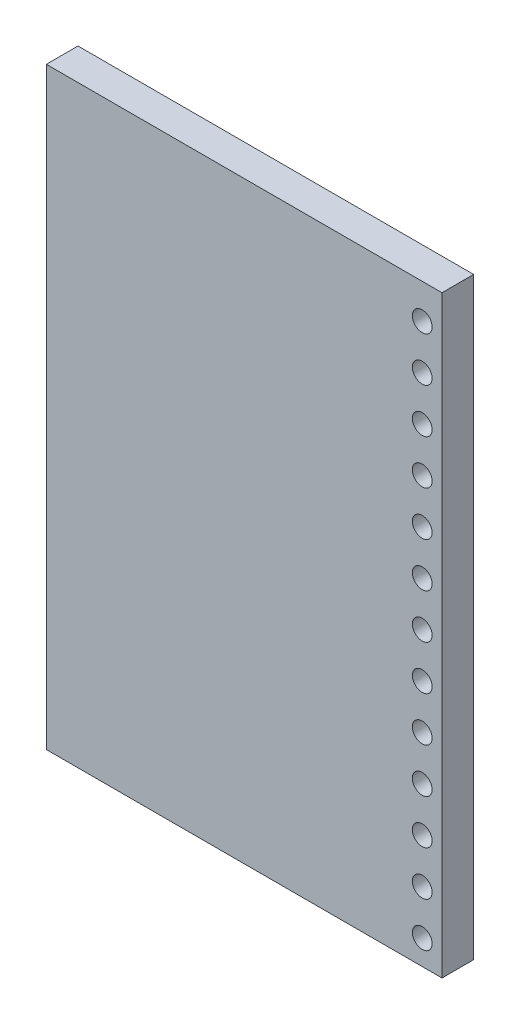
ISO-10303-21;
HEADER;
FILE_DESCRIPTION(('STEP AP214'),'2;1');
FILE_NAME('part.step','',(''),(''),'','','');
FILE_SCHEMA(('AUTOMOTIVE_DESIGN { 1 0 10303 214 1 1 1 1 }'));
ENDSEC;
DATA;
#1=APPLICATION_CONTEXT('core data for automotive mechanical design processes');
#2=APPLICATION_PROTOCOL_DEFINITION('international standard','automotive_design',2000,#1);
#3=PRODUCT_CONTEXT('',#1,'mechanical');
#4=PRODUCT('Part','Part','',(#3));
#5=PRODUCT_RELATED_PRODUCT_CATEGORY('part','',(#4));
#6=PRODUCT_DEFINITION_FORMATION('','',#4);
#7=PRODUCT_DEFINITION_CONTEXT('part definition',#1,'design');
#8=PRODUCT_DEFINITION('design','',#6,#7);
#9=PRODUCT_DEFINITION_SHAPE('','',#8);
#10=(LENGTH_UNIT() NAMED_UNIT(*) SI_UNIT(.MILLI.,.METRE.));
#11=(NAMED_UNIT(*) PLANE_ANGLE_UNIT() SI_UNIT($,.RADIAN.));
#12=(NAMED_UNIT(*) SI_UNIT($,.STERADIAN.) SOLID_ANGLE_UNIT());
#13=UNCERTAINTY_MEASURE_WITH_UNIT(LENGTH_MEASURE(1.E-05),#10,'distance_accuracy_value','');
#14=(GEOMETRIC_REPRESENTATION_CONTEXT(3) GLOBAL_UNCERTAINTY_ASSIGNED_CONTEXT((#13)) GLOBAL_UNIT_ASSIGNED_CONTEXT((#10,
#11,#12)) REPRESENTATION_CONTEXT('',''));
#15=CARTESIAN_POINT('',(0.,0.,0.));
#16=DIRECTION('',(0.,0.,1.));
#17=DIRECTION('',(1.,0.,0.));
#18=AXIS2_PLACEMENT_3D('',#15,#16,#17);
#19=CARTESIAN_POINT('',(90.,282.5,0.));
#20=DIRECTION('',(0.,0.,1.));
#21=DIRECTION('',(1.,0.,0.));
#22=AXIS2_PLACEMENT_3D('',#19,#20,#21);
#23=CYLINDRICAL_SURFACE('',#22,5.);
#24=CARTESIAN_POINT('',(90.,282.5,0.));
#25=DIRECTION('',(0.,0.,1.));
#26=DIRECTION('',(1.,0.,0.));
#27=AXIS2_PLACEMENT_3D('',#24,#25,#26);
#28=CIRCLE('',#27,5.);
#29=CARTESIAN_POINT('',(95.,282.5,0.));
#30=VERTEX_POINT('',#29);
#31=EDGE_CURVE('E47',#30,#30,#28,.T.);
#32=ORIENTED_EDGE('',*,*,#31,.F.);
#33=EDGE_LOOP('',(#32));
#34=FACE_BOUND('',#33,.T.);
#35=CARTESIAN_POINT('',(90.,282.5,16.));
#36=DIRECTION('',(0.,0.,-1.));
#37=DIRECTION('',(-1.,0.,0.));
#38=AXIS2_PLACEMENT_3D('',#35,#36,#37);
#39=CIRCLE('',#38,5.);
#40=CARTESIAN_POINT('',(85.,282.5,16.));
#41=VERTEX_POINT('',#40);
#42=EDGE_CURVE('E11',#41,#41,#39,.T.);
#43=ORIENTED_EDGE('',*,*,#42,.F.);
#44=EDGE_LOOP('',(#43));
#45=FACE_BOUND('',#44,.T.);
#46=ADVANCED_FACE('F39',(#34,#45),#23,.F.);
#47=CARTESIAN_POINT('',(90.,260.,0.));
#48=DIRECTION('',(0.,0.,1.));
#49=DIRECTION('',(1.,0.,0.));
#50=AXIS2_PLACEMENT_3D('',#47,#48,#49);
#51=CYLINDRICAL_SURFACE('',#50,5.);
#52=CARTESIAN_POINT('',(90.,260.,0.));
#53=DIRECTION('',(0.,0.,1.));
#54=DIRECTION('',(1.,0.,0.));
#55=AXIS2_PLACEMENT_3D('',#52,#53,#54);
#56=CIRCLE('',#55,5.);
#57=CARTESIAN_POINT('',(95.,260.,0.));
#58=VERTEX_POINT('',#57);
#59=EDGE_CURVE('E171',#58,#58,#56,.T.);
#60=ORIENTED_EDGE('',*,*,#59,.F.);
#61=EDGE_LOOP('',(#60));
#62=FACE_BOUND('',#61,.T.);
#63=CARTESIAN_POINT('',(90.,260.,16.));
#64=DIRECTION('',(0.,0.,-1.));
#65=DIRECTION('',(-1.,0.,0.));
#66=AXIS2_PLACEMENT_3D('',#63,#64,#65);
#67=CIRCLE('',#66,5.);
#68=CARTESIAN_POINT('',(85.,260.,16.));
#69=VERTEX_POINT('',#68);
#70=EDGE_CURVE('E174',#69,#69,#67,.T.);
#71=ORIENTED_EDGE('',*,*,#70,.F.);
#72=EDGE_LOOP('',(#71));
#73=FACE_BOUND('',#72,.T.);
#74=ADVANCED_FACE('F183',(#62,#73),#51,.F.);
#75=CARTESIAN_POINT('',(90.,237.5,0.));
#76=DIRECTION('',(0.,0.,1.));
#77=DIRECTION('',(1.,0.,0.));
#78=AXIS2_PLACEMENT_3D('',#75,#76,#77);
#79=CYLINDRICAL_SURFACE('',#78,5.);
#80=CARTESIAN_POINT('',(90.,237.5,0.));
#81=DIRECTION('',(0.,0.,1.));
#82=DIRECTION('',(1.,0.,0.));
#83=AXIS2_PLACEMENT_3D('',#80,#81,#82);
#84=CIRCLE('',#83,5.);
#85=CARTESIAN_POINT('',(95.,237.5,0.));
#86=VERTEX_POINT('',#85);
#87=EDGE_CURVE('E165',#86,#86,#84,.T.);
#88=ORIENTED_EDGE('',*,*,#87,.F.);
#89=EDGE_LOOP('',(#88));
#90=FACE_BOUND('',#89,.T.);
#91=CARTESIAN_POINT('',(90.,237.5,16.));
#92=DIRECTION('',(0.,0.,-1.));
#93=DIRECTION('',(-1.,0.,0.));
#94=AXIS2_PLACEMENT_3D('',#91,#92,#93);
#95=CIRCLE('',#94,5.);
#96=CARTESIAN_POINT('',(85.,237.5,16.));
#97=VERTEX_POINT('',#96);
#98=EDGE_CURVE('E168',#97,#97,#95,.T.);
#99=ORIENTED_EDGE('',*,*,#98,.F.);
#100=EDGE_LOOP('',(#99));
#101=FACE_BOUND('',#100,.T.);
#102=ADVANCED_FACE('F242',(#90,#101),#79,.F.);
#103=CARTESIAN_POINT('',(90.,215.,0.));
#104=DIRECTION('',(0.,0.,1.));
#105=DIRECTION('',(1.,0.,0.));
#106=AXIS2_PLACEMENT_3D('',#103,#104,#105);
#107=CYLINDRICAL_SURFACE('',#106,5.);
#108=CARTESIAN_POINT('',(90.,215.,0.));
#109=DIRECTION('',(0.,0.,1.));
#110=DIRECTION('',(1.,0.,0.));
#111=AXIS2_PLACEMENT_3D('',#108,#109,#110);
#112=CIRCLE('',#111,5.);
#113=CARTESIAN_POINT('',(95.,215.,0.));
#114=VERTEX_POINT('',#113);
#115=EDGE_CURVE('E159',#114,#114,#112,.T.);
#116=ORIENTED_EDGE('',*,*,#115,.F.);
#117=EDGE_LOOP('',(#116));
#118=FACE_BOUND('',#117,.T.);
#119=CARTESIAN_POINT('',(90.,215.,16.));
#120=DIRECTION('',(0.,0.,-1.));
#121=DIRECTION('',(-1.,0.,0.));
#122=AXIS2_PLACEMENT_3D('',#119,#120,#121);
#123=CIRCLE('',#122,5.);
#124=CARTESIAN_POINT('',(85.,215.,16.));
#125=VERTEX_POINT('',#124);
#126=EDGE_CURVE('E162',#125,#125,#123,.T.);
#127=ORIENTED_EDGE('',*,*,#126,.F.);
#128=EDGE_LOOP('',(#127));
#129=FACE_BOUND('',#128,.T.);
#130=ADVANCED_FACE('F238',(#118,#129),#107,.F.);
#131=CARTESIAN_POINT('',(90.,192.5,0.));
#132=DIRECTION('',(0.,0.,1.));
#133=DIRECTION('',(1.,0.,0.));
#134=AXIS2_PLACEMENT_3D('',#131,#132,#133);
#135=CYLINDRICAL_SURFACE('',#134,5.);
#136=CARTESIAN_POINT('',(90.,192.5,0.));
#137=DIRECTION('',(0.,0.,1.));
#138=DIRECTION('',(1.,0.,0.));
#139=AXIS2_PLACEMENT_3D('',#136,#137,#138);
#140=CIRCLE('',#139,5.);
#141=CARTESIAN_POINT('',(95.,192.5,0.));
#142=VERTEX_POINT('',#141);
#143=EDGE_CURVE('E153',#142,#142,#140,.T.);
#144=ORIENTED_EDGE('',*,*,#143,.F.);
#145=EDGE_LOOP('',(#144));
#146=FACE_BOUND('',#145,.T.);
#147=CARTESIAN_POINT('',(90.,192.5,16.));
#148=DIRECTION('',(0.,0.,-1.));
#149=DIRECTION('',(-1.,0.,0.));
#150=AXIS2_PLACEMENT_3D('',#147,#148,#149);
#151=CIRCLE('',#150,5.);
#152=CARTESIAN_POINT('',(85.,192.5,16.));
#153=VERTEX_POINT('',#152);
#154=EDGE_CURVE('E156',#153,#153,#151,.T.);
#155=ORIENTED_EDGE('',*,*,#154,.F.);
#156=EDGE_LOOP('',(#155));
#157=FACE_BOUND('',#156,.T.);
#158=ADVANCED_FACE('F234',(#146,#157),#135,.F.);
#159=CARTESIAN_POINT('',(90.,170.,0.));
#160=DIRECTION('',(0.,0.,1.));
#161=DIRECTION('',(1.,0.,0.));
#162=AXIS2_PLACEMENT_3D('',#159,#160,#161);
#163=CYLINDRICAL_SURFACE('',#162,5.);
#164=CARTESIAN_POINT('',(90.,170.,0.));
#165=DIRECTION('',(0.,0.,1.));
#166=DIRECTION('',(1.,0.,0.));
#167=AXIS2_PLACEMENT_3D('',#164,#165,#166);
#168=CIRCLE('',#167,5.);
#169=CARTESIAN_POINT('',(95.,170.,0.));
#170=VERTEX_POINT('',#169);
#171=EDGE_CURVE('E147',#170,#170,#168,.T.);
#172=ORIENTED_EDGE('',*,*,#171,.F.);
#173=EDGE_LOOP('',(#172));
#174=FACE_BOUND('',#173,.T.);
#175=CARTESIAN_POINT('',(90.,170.,16.));
#176=DIRECTION('',(0.,0.,-1.));
#177=DIRECTION('',(-1.,0.,0.));
#178=AXIS2_PLACEMENT_3D('',#175,#176,#177);
#179=CIRCLE('',#178,5.);
#180=CARTESIAN_POINT('',(85.,170.,16.));
#181=VERTEX_POINT('',#180);
#182=EDGE_CURVE('E150',#181,#181,#179,.T.);
#183=ORIENTED_EDGE('',*,*,#182,.F.);
#184=EDGE_LOOP('',(#183));
#185=FACE_BOUND('',#184,.T.);
#186=ADVANCED_FACE('F230',(#174,#185),#163,.F.);
#187=CARTESIAN_POINT('',(90.,147.5,0.));
#188=DIRECTION('',(0.,0.,1.));
#189=DIRECTION('',(1.,0.,0.));
#190=AXIS2_PLACEMENT_3D('',#187,#188,#189);
#191=CYLINDRICAL_SURFACE('',#190,5.);
#192=CARTESIAN_POINT('',(90.,147.5,0.));
#193=DIRECTION('',(0.,0.,1.));
#194=DIRECTION('',(1.,0.,0.));
#195=AXIS2_PLACEMENT_3D('',#192,#193,#194);
#196=CIRCLE('',#195,5.);
#197=CARTESIAN_POINT('',(95.,147.5,0.));
#198=VERTEX_POINT('',#197);
#199=EDGE_CURVE('E141',#198,#198,#196,.T.);
#200=ORIENTED_EDGE('',*,*,#199,.F.);
#201=EDGE_LOOP('',(#200));
#202=FACE_BOUND('',#201,.T.);
#203=CARTESIAN_POINT('',(90.,147.5,16.));
#204=DIRECTION('',(0.,0.,-1.));
#205=DIRECTION('',(-1.,0.,0.));
#206=AXIS2_PLACEMENT_3D('',#203,#204,#205);
#207=CIRCLE('',#206,5.);
#208=CARTESIAN_POINT('',(85.,147.5,16.));
#209=VERTEX_POINT('',#208);
#210=EDGE_CURVE('E144',#209,#209,#207,.T.);
#211=ORIENTED_EDGE('',*,*,#210,.F.);
#212=EDGE_LOOP('',(#211));
#213=FACE_BOUND('',#212,.T.);
#214=ADVANCED_FACE('F226',(#202,#213),#191,.F.);
#215=CARTESIAN_POINT('',(90.,125.,0.));
#216=DIRECTION('',(0.,0.,1.));
#217=DIRECTION('',(1.,0.,0.));
#218=AXIS2_PLACEMENT_3D('',#215,#216,#217);
#219=CYLINDRICAL_SURFACE('',#218,5.);
#220=CARTESIAN_POINT('',(90.,125.,0.));
#221=DIRECTION('',(0.,0.,1.));
#222=DIRECTION('',(1.,0.,0.));
#223=AXIS2_PLACEMENT_3D('',#220,#221,#222);
#224=CIRCLE('',#223,5.);
#225=CARTESIAN_POINT('',(95.,125.,0.));
#226=VERTEX_POINT('',#225);
#227=EDGE_CURVE('E135',#226,#226,#224,.T.);
#228=ORIENTED_EDGE('',*,*,#227,.F.);
#229=EDGE_LOOP('',(#228));
#230=FACE_BOUND('',#229,.T.);
#231=CARTESIAN_POINT('',(90.,125.,16.));
#232=DIRECTION('',(0.,0.,-1.));
#233=DIRECTION('',(-1.,0.,0.));
#234=AXIS2_PLACEMENT_3D('',#231,#232,#233);
#235=CIRCLE('',#234,5.);
#236=CARTESIAN_POINT('',(85.,125.,16.));
#237=VERTEX_POINT('',#236);
#238=EDGE_CURVE('E138',#237,#237,#235,.T.);
#239=ORIENTED_EDGE('',*,*,#238,.F.);
#240=EDGE_LOOP('',(#239));
#241=FACE_BOUND('',#240,.T.);
#242=ADVANCED_FACE('F222',(#230,#241),#219,.F.);
#243=CARTESIAN_POINT('',(90.,102.5,0.));
#244=DIRECTION('',(0.,0.,1.));
#245=DIRECTION('',(1.,0.,0.));
#246=AXIS2_PLACEMENT_3D('',#243,#244,#245);
#247=CYLINDRICAL_SURFACE('',#246,5.);
#248=CARTESIAN_POINT('',(90.,102.5,0.));
#249=DIRECTION('',(0.,0.,1.));
#250=DIRECTION('',(1.,0.,0.));
#251=AXIS2_PLACEMENT_3D('',#248,#249,#250);
#252=CIRCLE('',#251,5.);
#253=CARTESIAN_POINT('',(95.,102.5,0.));
#254=VERTEX_POINT('',#253);
#255=EDGE_CURVE('E129',#254,#254,#252,.T.);
#256=ORIENTED_EDGE('',*,*,#255,.F.);
#257=EDGE_LOOP('',(#256));
#258=FACE_BOUND('',#257,.T.);
#259=CARTESIAN_POINT('',(90.,102.5,16.));
#260=DIRECTION('',(0.,0.,-1.));
#261=DIRECTION('',(-1.,0.,0.));
#262=AXIS2_PLACEMENT_3D('',#259,#260,#261);
#263=CIRCLE('',#262,5.);
#264=CARTESIAN_POINT('',(85.,102.5,16.));
#265=VERTEX_POINT('',#264);
#266=EDGE_CURVE('E132',#265,#265,#263,.T.);
#267=ORIENTED_EDGE('',*,*,#266,.F.);
#268=EDGE_LOOP('',(#267));
#269=FACE_BOUND('',#268,.T.);
#270=ADVANCED_FACE('F218',(#258,#269),#247,.F.);
#271=CARTESIAN_POINT('',(90.,80.,0.));
#272=DIRECTION('',(0.,0.,1.));
#273=DIRECTION('',(1.,0.,0.));
#274=AXIS2_PLACEMENT_3D('',#271,#272,#273);
#275=CYLINDRICAL_SURFACE('',#274,5.);
#276=CARTESIAN_POINT('',(90.,80.,0.));
#277=DIRECTION('',(0.,0.,1.));
#278=DIRECTION('',(1.,0.,0.));
#279=AXIS2_PLACEMENT_3D('',#276,#277,#278);
#280=CIRCLE('',#279,5.);
#281=CARTESIAN_POINT('',(95.,80.,0.));
#282=VERTEX_POINT('',#281);
#283=EDGE_CURVE('E123',#282,#282,#280,.T.);
#284=ORIENTED_EDGE('',*,*,#283,.F.);
#285=EDGE_LOOP('',(#284));
#286=FACE_BOUND('',#285,.T.);
#287=CARTESIAN_POINT('',(90.,80.,16.));
#288=DIRECTION('',(0.,0.,-1.));
#289=DIRECTION('',(-1.,0.,0.));
#290=AXIS2_PLACEMENT_3D('',#287,#288,#289);
#291=CIRCLE('',#290,5.);
#292=CARTESIAN_POINT('',(85.,80.,16.));
#293=VERTEX_POINT('',#292);
#294=EDGE_CURVE('E126',#293,#293,#291,.T.);
#295=ORIENTED_EDGE('',*,*,#294,.F.);
#296=EDGE_LOOP('',(#295));
#297=FACE_BOUND('',#296,.T.);
#298=ADVANCED_FACE('F214',(#286,#297),#275,.F.);
#299=CARTESIAN_POINT('',(90.,57.5,0.));
#300=DIRECTION('',(0.,0.,1.));
#301=DIRECTION('',(1.,0.,0.));
#302=AXIS2_PLACEMENT_3D('',#299,#300,#301);
#303=CYLINDRICAL_SURFACE('',#302,5.);
#304=CARTESIAN_POINT('',(90.,57.5,0.));
#305=DIRECTION('',(0.,0.,1.));
#306=DIRECTION('',(1.,0.,0.));
#307=AXIS2_PLACEMENT_3D('',#304,#305,#306);
#308=CIRCLE('',#307,5.);
#309=CARTESIAN_POINT('',(95.,57.5,0.));
#310=VERTEX_POINT('',#309);
#311=EDGE_CURVE('E117',#310,#310,#308,.T.);
#312=ORIENTED_EDGE('',*,*,#311,.F.);
#313=EDGE_LOOP('',(#312));
#314=FACE_BOUND('',#313,.T.);
#315=CARTESIAN_POINT('',(90.,57.5,16.));
#316=DIRECTION('',(0.,0.,-1.));
#317=DIRECTION('',(-1.,0.,0.));
#318=AXIS2_PLACEMENT_3D('',#315,#316,#317);
#319=CIRCLE('',#318,5.);
#320=CARTESIAN_POINT('',(85.,57.5,16.));
#321=VERTEX_POINT('',#320);
#322=EDGE_CURVE('E120',#321,#321,#319,.T.);
#323=ORIENTED_EDGE('',*,*,#322,.F.);
#324=EDGE_LOOP('',(#323));
#325=FACE_BOUND('',#324,.T.);
#326=ADVANCED_FACE('F211',(#314,#325),#303,.F.);
#327=CARTESIAN_POINT('',(-100.,0.,16.));
#328=DIRECTION('',(1.,0.,0.));
#329=DIRECTION('',(0.,1.,0.));
#330=AXIS2_PLACEMENT_3D('',#327,#328,#329);
#331=PLANE('',#330);
#332=DIRECTION('',(0.,-1.,0.));
#333=VECTOR('',#332,1.);
#334=CARTESIAN_POINT('',(-100.,0.,0.));
#335=LINE('',#334,#333);
#336=CARTESIAN_POINT('',(-100.,300.,0.));
#337=VERTEX_POINT('',#336);
#338=CARTESIAN_POINT('',(-100.,0.,0.));
#339=VERTEX_POINT('',#338);
#340=EDGE_CURVE('E107',#337,#339,#335,.T.);
#341=ORIENTED_EDGE('',*,*,#340,.T.);
#342=DIRECTION('',(0.,0.,-1.));
#343=VECTOR('',#342,1.);
#344=CARTESIAN_POINT('',(-100.,0.,16.));
#345=LINE('',#344,#343);
#346=CARTESIAN_POINT('',(-100.,0.,16.));
#347=VERTEX_POINT('',#346);
#348=EDGE_CURVE('E98',#347,#339,#345,.T.);
#349=ORIENTED_EDGE('',*,*,#348,.F.);
#350=DIRECTION('',(0.,-1.,0.));
#351=VECTOR('',#350,1.);
#352=CARTESIAN_POINT('',(-100.,0.,16.));
#353=LINE('',#352,#351);
#354=CARTESIAN_POINT('',(-100.,300.,16.));
#355=VERTEX_POINT('',#354);
#356=EDGE_CURVE('E92',#355,#347,#353,.T.);
#357=ORIENTED_EDGE('',*,*,#356,.F.);
#358=DIRECTION('',(0.,0.,-1.));
#359=VECTOR('',#358,1.);
#360=CARTESIAN_POINT('',(-100.,300.,16.));
#361=LINE('',#360,#359);
#362=EDGE_CURVE('E103',#355,#337,#361,.T.);
#363=ORIENTED_EDGE('',*,*,#362,.T.);
#364=EDGE_LOOP('',(#341,#349,#357,#363));
#365=FACE_BOUND('',#364,.T.);
#366=ADVANCED_FACE('F208',(#365),#331,.F.);
#367=CARTESIAN_POINT('',(-100.,0.,16.));
#368=DIRECTION('',(0.,1.,0.));
#369=DIRECTION('',(-1.,0.,0.));
#370=AXIS2_PLACEMENT_3D('',#367,#368,#369);
#371=PLANE('',#370);
#372=DIRECTION('',(1.,0.,0.));
#373=VECTOR('',#372,1.);
#374=CARTESIAN_POINT('',(-100.,0.,0.));
#375=LINE('',#374,#373);
#376=CARTESIAN_POINT('',(100.,0.,0.));
#377=VERTEX_POINT('',#376);
#378=EDGE_CURVE('E97',#339,#377,#375,.T.);
#379=ORIENTED_EDGE('',*,*,#378,.T.);
#380=DIRECTION('',(0.,0.,-1.));
#381=VECTOR('',#380,1.);
#382=CARTESIAN_POINT('',(100.,0.,16.));
#383=LINE('',#382,#381);
#384=CARTESIAN_POINT('',(100.,0.,16.));
#385=VERTEX_POINT('',#384);
#386=EDGE_CURVE('E95',#385,#377,#383,.T.);
#387=ORIENTED_EDGE('',*,*,#386,.F.);
#388=DIRECTION('',(1.,0.,0.));
#389=VECTOR('',#388,1.);
#390=CARTESIAN_POINT('',(-100.,0.,16.));
#391=LINE('',#390,#389);
#392=EDGE_CURVE('E86',#347,#385,#391,.T.);
#393=ORIENTED_EDGE('',*,*,#392,.F.);
#394=ORIENTED_EDGE('',*,*,#348,.T.);
#395=EDGE_LOOP('',(#379,#387,#393,#394));
#396=FACE_BOUND('',#395,.T.);
#397=ADVANCED_FACE('F96',(#396),#371,.F.);
#398=CARTESIAN_POINT('',(100.,0.,16.));
#399=DIRECTION('',(-1.,0.,0.));
#400=DIRECTION('',(0.,-1.,0.));
#401=AXIS2_PLACEMENT_3D('',#398,#399,#400);
#402=PLANE('',#401);
#403=DIRECTION('',(0.,1.,0.));
#404=VECTOR('',#403,1.);
#405=CARTESIAN_POINT('',(100.,0.,0.));
#406=LINE('',#405,#404);
#407=CARTESIAN_POINT('',(100.,300.,0.));
#408=VERTEX_POINT('',#407);
#409=EDGE_CURVE('E72',#377,#408,#406,.T.);
#410=ORIENTED_EDGE('',*,*,#409,.T.);
#411=DIRECTION('',(0.,0.,-1.));
#412=VECTOR('',#411,1.);
#413=CARTESIAN_POINT('',(100.,300.,16.));
#414=LINE('',#413,#412);
#415=CARTESIAN_POINT('',(100.,300.,16.));
#416=VERTEX_POINT('',#415);
#417=EDGE_CURVE('E99',#416,#408,#414,.T.);
#418=ORIENTED_EDGE('',*,*,#417,.F.);
#419=DIRECTION('',(0.,1.,0.));
#420=VECTOR('',#419,1.);
#421=CARTESIAN_POINT('',(100.,0.,16.));
#422=LINE('',#421,#420);
#423=EDGE_CURVE('E90',#385,#416,#422,.T.);
#424=ORIENTED_EDGE('',*,*,#423,.F.);
#425=ORIENTED_EDGE('',*,*,#386,.T.);
#426=EDGE_LOOP('',(#410,#418,#424,#425));
#427=FACE_BOUND('',#426,.T.);
#428=ADVANCED_FACE('F101',(#427),#402,.F.);
#429=CARTESIAN_POINT('',(-100.,300.,16.));
#430=DIRECTION('',(0.,-1.,0.));
#431=DIRECTION('',(1.,0.,0.));
#432=AXIS2_PLACEMENT_3D('',#429,#430,#431);
#433=PLANE('',#432);
#434=DIRECTION('',(-1.,0.,0.));
#435=VECTOR('',#434,1.);
#436=CARTESIAN_POINT('',(-100.,300.,0.));
#437=LINE('',#436,#435);
#438=EDGE_CURVE('E78',#408,#337,#437,.T.);
#439=ORIENTED_EDGE('',*,*,#438,.T.);
#440=ORIENTED_EDGE('',*,*,#362,.F.);
#441=DIRECTION('',(-1.,0.,0.));
#442=VECTOR('',#441,1.);
#443=CARTESIAN_POINT('',(-100.,300.,16.));
#444=LINE('',#443,#442);
#445=EDGE_CURVE('E55',#416,#355,#444,.T.);
#446=ORIENTED_EDGE('',*,*,#445,.F.);
#447=ORIENTED_EDGE('',*,*,#417,.T.);
#448=EDGE_LOOP('',(#439,#440,#446,#447));
#449=FACE_BOUND('',#448,.T.);
#450=ADVANCED_FACE('F187',(#449),#433,.F.);
#451=CARTESIAN_POINT('',(0.,0.,16.));
#452=DIRECTION('',(0.,0.,-1.));
#453=DIRECTION('',(-1.,0.,0.));
#454=AXIS2_PLACEMENT_3D('',#451,#452,#453);
#455=PLANE('',#454);
#456=CARTESIAN_POINT('',(90.,35.,16.));
#457=DIRECTION('',(0.,0.,-1.));
#458=DIRECTION('',(-1.,0.,0.));
#459=AXIS2_PLACEMENT_3D('',#456,#457,#458);
#460=CIRCLE('',#459,5.);
#461=CARTESIAN_POINT('',(85.,35.,16.));
#462=VERTEX_POINT('',#461);
#463=EDGE_CURVE('E377',#462,#462,#460,.T.);
#464=ORIENTED_EDGE('',*,*,#463,.T.);
#465=EDGE_LOOP('',(#464));
#466=FACE_BOUND('',#465,.T.);
#467=CARTESIAN_POINT('',(90.,12.5,16.));
#468=DIRECTION('',(0.,0.,-1.));
#469=DIRECTION('',(-1.,0.,0.));
#470=AXIS2_PLACEMENT_3D('',#467,#468,#469);
#471=CIRCLE('',#470,5.);
#472=CARTESIAN_POINT('',(85.,12.5,16.));
#473=VERTEX_POINT('',#472);
#474=EDGE_CURVE('E110',#473,#473,#471,.T.);
#475=ORIENTED_EDGE('',*,*,#474,.T.);
#476=EDGE_LOOP('',(#475));
#477=FACE_BOUND('',#476,.T.);
#478=ORIENTED_EDGE('',*,*,#356,.T.);
#479=ORIENTED_EDGE('',*,*,#392,.T.);
#480=ORIENTED_EDGE('',*,*,#423,.T.);
#481=ORIENTED_EDGE('',*,*,#445,.T.);
#482=EDGE_LOOP('',(#478,#479,#480,#481));
#483=FACE_BOUND('',#482,.T.);
#484=ORIENTED_EDGE('',*,*,#322,.T.);
#485=EDGE_LOOP('',(#484));
#486=FACE_BOUND('',#485,.T.);
#487=ORIENTED_EDGE('',*,*,#294,.T.);
#488=EDGE_LOOP('',(#487));
#489=FACE_BOUND('',#488,.T.);
#490=ORIENTED_EDGE('',*,*,#266,.T.);
#491=EDGE_LOOP('',(#490));
#492=FACE_BOUND('',#491,.T.);
#493=ORIENTED_EDGE('',*,*,#238,.T.);
#494=EDGE_LOOP('',(#493));
#495=FACE_BOUND('',#494,.T.);
#496=ORIENTED_EDGE('',*,*,#210,.T.);
#497=EDGE_LOOP('',(#496));
#498=FACE_BOUND('',#497,.T.);
#499=ORIENTED_EDGE('',*,*,#182,.T.);
#500=EDGE_LOOP('',(#499));
#501=FACE_BOUND('',#500,.T.);
#502=ORIENTED_EDGE('',*,*,#154,.T.);
#503=EDGE_LOOP('',(#502));
#504=FACE_BOUND('',#503,.T.);
#505=ORIENTED_EDGE('',*,*,#126,.T.);
#506=EDGE_LOOP('',(#505));
#507=FACE_BOUND('',#506,.T.);
#508=ORIENTED_EDGE('',*,*,#98,.T.);
#509=EDGE_LOOP('',(#508));
#510=FACE_BOUND('',#509,.T.);
#511=ORIENTED_EDGE('',*,*,#70,.T.);
#512=EDGE_LOOP('',(#511));
#513=FACE_BOUND('',#512,.T.);
#514=ORIENTED_EDGE('',*,*,#42,.T.);
#515=EDGE_LOOP('',(#514));
#516=FACE_BOUND('',#515,.T.);
#517=ADVANCED_FACE('F87',(#466,#477,#483,#486,#489,#492,#495,#498,#501,#504,#507,#510,#513,
#516),#455,.F.);
#518=CARTESIAN_POINT('',(0.,0.,0.));
#519=DIRECTION('',(0.,0.,-1.));
#520=DIRECTION('',(-1.,0.,0.));
#521=AXIS2_PLACEMENT_3D('',#518,#519,#520);
#522=PLANE('',#521);
#523=CARTESIAN_POINT('',(90.,35.,0.));
#524=DIRECTION('',(0.,0.,1.));
#525=DIRECTION('',(1.,0.,0.));
#526=AXIS2_PLACEMENT_3D('',#523,#524,#525);
#527=CIRCLE('',#526,5.);
#528=CARTESIAN_POINT('',(95.,35.,0.));
#529=VERTEX_POINT('',#528);
#530=EDGE_CURVE('E381',#529,#529,#527,.T.);
#531=ORIENTED_EDGE('',*,*,#530,.T.);
#532=EDGE_LOOP('',(#531));
#533=FACE_BOUND('',#532,.T.);
#534=CARTESIAN_POINT('',(90.,12.5,0.));
#535=DIRECTION('',(0.,0.,1.));
#536=DIRECTION('',(1.,0.,0.));
#537=AXIS2_PLACEMENT_3D('',#534,#535,#536);
#538=CIRCLE('',#537,5.);
#539=CARTESIAN_POINT('',(95.,12.5,0.));
#540=VERTEX_POINT('',#539);
#541=EDGE_CURVE('E373',#540,#540,#538,.T.);
#542=ORIENTED_EDGE('',*,*,#541,.T.);
#543=EDGE_LOOP('',(#542));
#544=FACE_BOUND('',#543,.T.);
#545=ORIENTED_EDGE('',*,*,#340,.F.);
#546=ORIENTED_EDGE('',*,*,#438,.F.);
#547=ORIENTED_EDGE('',*,*,#409,.F.);
#548=ORIENTED_EDGE('',*,*,#378,.F.);
#549=EDGE_LOOP('',(#545,#546,#547,#548));
#550=FACE_BOUND('',#549,.T.);
#551=ORIENTED_EDGE('',*,*,#311,.T.);
#552=EDGE_LOOP('',(#551));
#553=FACE_BOUND('',#552,.T.);
#554=ORIENTED_EDGE('',*,*,#283,.T.);
#555=EDGE_LOOP('',(#554));
#556=FACE_BOUND('',#555,.T.);
#557=ORIENTED_EDGE('',*,*,#255,.T.);
#558=EDGE_LOOP('',(#557));
#559=FACE_BOUND('',#558,.T.);
#560=ORIENTED_EDGE('',*,*,#227,.T.);
#561=EDGE_LOOP('',(#560));
#562=FACE_BOUND('',#561,.T.);
#563=ORIENTED_EDGE('',*,*,#199,.T.);
#564=EDGE_LOOP('',(#563));
#565=FACE_BOUND('',#564,.T.);
#566=ORIENTED_EDGE('',*,*,#171,.T.);
#567=EDGE_LOOP('',(#566));
#568=FACE_BOUND('',#567,.T.);
#569=ORIENTED_EDGE('',*,*,#143,.T.);
#570=EDGE_LOOP('',(#569));
#571=FACE_BOUND('',#570,.T.);
#572=ORIENTED_EDGE('',*,*,#115,.T.);
#573=EDGE_LOOP('',(#572));
#574=FACE_BOUND('',#573,.T.);
#575=ORIENTED_EDGE('',*,*,#87,.T.);
#576=EDGE_LOOP('',(#575));
#577=FACE_BOUND('',#576,.T.);
#578=ORIENTED_EDGE('',*,*,#59,.T.);
#579=EDGE_LOOP('',(#578));
#580=FACE_BOUND('',#579,.T.);
#581=ORIENTED_EDGE('',*,*,#31,.T.);
#582=EDGE_LOOP('',(#581));
#583=FACE_BOUND('',#582,.T.);
#584=ADVANCED_FACE('F179',(#533,#544,#550,#553,#556,#559,#562,#565,#568,#571,#574,#577,#580,
#583),#522,.T.);
#585=CARTESIAN_POINT('',(90.,12.5,0.));
#586=DIRECTION('',(0.,0.,1.));
#587=DIRECTION('',(1.,0.,0.));
#588=AXIS2_PLACEMENT_3D('',#585,#586,#587);
#589=CYLINDRICAL_SURFACE('',#588,5.);
#590=ORIENTED_EDGE('',*,*,#541,.F.);
#591=EDGE_LOOP('',(#590));
#592=FACE_BOUND('',#591,.T.);
#593=ORIENTED_EDGE('',*,*,#474,.F.);
#594=EDGE_LOOP('',(#593));
#595=FACE_BOUND('',#594,.T.);
#596=ADVANCED_FACE('F194',(#592,#595),#589,.F.);
#597=CARTESIAN_POINT('',(90.,35.,0.));
#598=DIRECTION('',(0.,0.,1.));
#599=DIRECTION('',(1.,0.,0.));
#600=AXIS2_PLACEMENT_3D('',#597,#598,#599);
#601=CYLINDRICAL_SURFACE('',#600,5.);
#602=ORIENTED_EDGE('',*,*,#530,.F.);
#603=EDGE_LOOP('',(#602));
#604=FACE_BOUND('',#603,.T.);
#605=ORIENTED_EDGE('',*,*,#463,.F.);
#606=EDGE_LOOP('',(#605));
#607=FACE_BOUND('',#606,.T.);
#608=ADVANCED_FACE('F309',(#604,#607),#601,.F.);
#609=CLOSED_SHELL('',(#46,#74,#102,#130,#158,#186,#214,#242,#270,#298,#326,#366,#397,#428,#450,
#517,#584,#596,#608));
#610=MANIFOLD_SOLID_BREP('B2',#609);
#611=ADVANCED_BREP_SHAPE_REPRESENTATION('',(#18,#610),#14);
#612=SHAPE_DEFINITION_REPRESENTATION(#9,#611);
ENDSEC;
END-ISO-10303-21;
